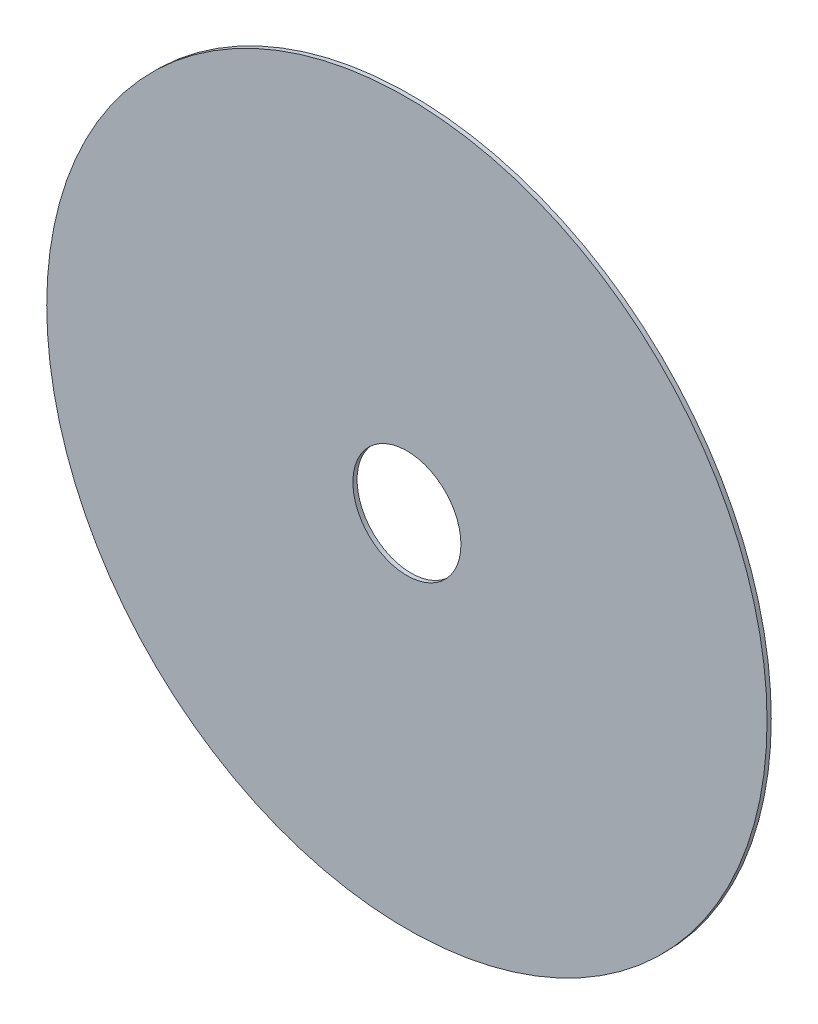
ISO-10303-21;
HEADER;
FILE_DESCRIPTION(('STEP AP214'),'2;1');
FILE_NAME('part.step','',(''),(''),'','','');
FILE_SCHEMA(('AUTOMOTIVE_DESIGN { 1 0 10303 214 1 1 1 1 }'));
ENDSEC;
DATA;
#1=APPLICATION_CONTEXT('core data for automotive mechanical design processes');
#2=APPLICATION_PROTOCOL_DEFINITION('international standard','automotive_design',2000,#1);
#3=PRODUCT_CONTEXT('',#1,'mechanical');
#4=PRODUCT('Part','Part','',(#3));
#5=PRODUCT_RELATED_PRODUCT_CATEGORY('part','',(#4));
#6=PRODUCT_DEFINITION_FORMATION('','',#4);
#7=PRODUCT_DEFINITION_CONTEXT('part definition',#1,'design');
#8=PRODUCT_DEFINITION('design','',#6,#7);
#9=PRODUCT_DEFINITION_SHAPE('','',#8);
#10=(LENGTH_UNIT() NAMED_UNIT(*) SI_UNIT(.MILLI.,.METRE.));
#11=(NAMED_UNIT(*) PLANE_ANGLE_UNIT() SI_UNIT($,.RADIAN.));
#12=(NAMED_UNIT(*) SI_UNIT($,.STERADIAN.) SOLID_ANGLE_UNIT());
#13=UNCERTAINTY_MEASURE_WITH_UNIT(LENGTH_MEASURE(1.E-05),#10,'distance_accuracy_value','');
#14=(GEOMETRIC_REPRESENTATION_CONTEXT(3) GLOBAL_UNCERTAINTY_ASSIGNED_CONTEXT((#13)) GLOBAL_UNIT_ASSIGNED_CONTEXT((#10,
#11,#12)) REPRESENTATION_CONTEXT('',''));
#15=CARTESIAN_POINT('',(0.,0.,0.));
#16=DIRECTION('',(0.,0.,1.));
#17=DIRECTION('',(1.,0.,0.));
#18=AXIS2_PLACEMENT_3D('',#15,#16,#17);
#19=CARTESIAN_POINT('',(0.,0.,0.1778));
#20=DIRECTION('',(0.,0.,1.));
#21=DIRECTION('',(1.,0.,0.));
#22=AXIS2_PLACEMENT_3D('',#19,#20,#21);
#23=PLANE('',#22);
#24=CARTESIAN_POINT('',(0.,0.,0.1778));
#25=DIRECTION('',(0.,0.,1.));
#26=DIRECTION('',(1.,0.,0.));
#27=AXIS2_PLACEMENT_3D('',#24,#25,#26);
#28=CIRCLE('',#27,15.24);
#29=CARTESIAN_POINT('',(15.24,0.,0.1778));
#30=VERTEX_POINT('',#29);
#31=EDGE_CURVE('E10',#30,#30,#28,.T.);
#32=ORIENTED_EDGE('',*,*,#31,.T.);
#33=EDGE_LOOP('',(#32));
#34=FACE_BOUND('',#33,.T.);
#35=CARTESIAN_POINT('',(0.,0.,0.1778));
#36=DIRECTION('',(0.,0.,1.));
#37=DIRECTION('',(1.,0.,0.));
#38=AXIS2_PLACEMENT_3D('',#35,#36,#37);
#39=CIRCLE('',#38,2.286);
#40=CARTESIAN_POINT('',(2.286,0.,0.1778));
#41=VERTEX_POINT('',#40);
#42=EDGE_CURVE('E42',#41,#41,#39,.T.);
#43=ORIENTED_EDGE('',*,*,#42,.F.);
#44=EDGE_LOOP('',(#43));
#45=FACE_BOUND('',#44,.T.);
#46=ADVANCED_FACE('F31',(#34,#45),#23,.T.);
#47=CARTESIAN_POINT('',(0.,0.,0.));
#48=DIRECTION('',(0.,0.,1.));
#49=DIRECTION('',(1.,0.,0.));
#50=AXIS2_PLACEMENT_3D('',#47,#48,#49);
#51=PLANE('',#50);
#52=CARTESIAN_POINT('',(0.,0.,0.));
#53=DIRECTION('',(0.,0.,1.));
#54=DIRECTION('',(1.,0.,0.));
#55=AXIS2_PLACEMENT_3D('',#52,#53,#54);
#56=CIRCLE('',#55,15.24);
#57=CARTESIAN_POINT('',(15.24,0.,0.));
#58=VERTEX_POINT('',#57);
#59=EDGE_CURVE('E35',#58,#58,#56,.T.);
#60=ORIENTED_EDGE('',*,*,#59,.F.);
#61=EDGE_LOOP('',(#60));
#62=FACE_BOUND('',#61,.T.);
#63=CARTESIAN_POINT('',(0.,0.,0.));
#64=DIRECTION('',(0.,0.,1.));
#65=DIRECTION('',(1.,0.,0.));
#66=AXIS2_PLACEMENT_3D('',#63,#64,#65);
#67=CIRCLE('',#66,2.286);
#68=CARTESIAN_POINT('',(2.286,0.,0.));
#69=VERTEX_POINT('',#68);
#70=EDGE_CURVE('E44',#69,#69,#67,.T.);
#71=ORIENTED_EDGE('',*,*,#70,.T.);
#72=EDGE_LOOP('',(#71));
#73=FACE_BOUND('',#72,.T.);
#74=ADVANCED_FACE('F54',(#62,#73),#51,.F.);
#75=CARTESIAN_POINT('',(0.,0.,0.1778));
#76=DIRECTION('',(0.,0.,-1.));
#77=DIRECTION('',(-1.,0.,0.));
#78=AXIS2_PLACEMENT_3D('',#75,#76,#77);
#79=CYLINDRICAL_SURFACE('',#78,15.24);
#80=ORIENTED_EDGE('',*,*,#31,.F.);
#81=EDGE_LOOP('',(#80));
#82=FACE_BOUND('',#81,.T.);
#83=ORIENTED_EDGE('',*,*,#59,.T.);
#84=EDGE_LOOP('',(#83));
#85=FACE_BOUND('',#84,.T.);
#86=ADVANCED_FACE('F33',(#82,#85),#79,.T.);
#87=CARTESIAN_POINT('',(0.,0.,0.1778));
#88=DIRECTION('',(0.,0.,-1.));
#89=DIRECTION('',(-1.,0.,0.));
#90=AXIS2_PLACEMENT_3D('',#87,#88,#89);
#91=CYLINDRICAL_SURFACE('',#90,2.286);
#92=ORIENTED_EDGE('',*,*,#42,.T.);
#93=EDGE_LOOP('',(#92));
#94=FACE_BOUND('',#93,.T.);
#95=ORIENTED_EDGE('',*,*,#70,.F.);
#96=EDGE_LOOP('',(#95));
#97=FACE_BOUND('',#96,.T.);
#98=ADVANCED_FACE('F50',(#94,#97),#91,.F.);
#99=CLOSED_SHELL('',(#46,#74,#86,#98));
#100=MANIFOLD_SOLID_BREP('B2',#99);
#101=ADVANCED_BREP_SHAPE_REPRESENTATION('',(#18,#100),#14);
#102=SHAPE_DEFINITION_REPRESENTATION(#9,#101);
ENDSEC;
END-ISO-10303-21;
